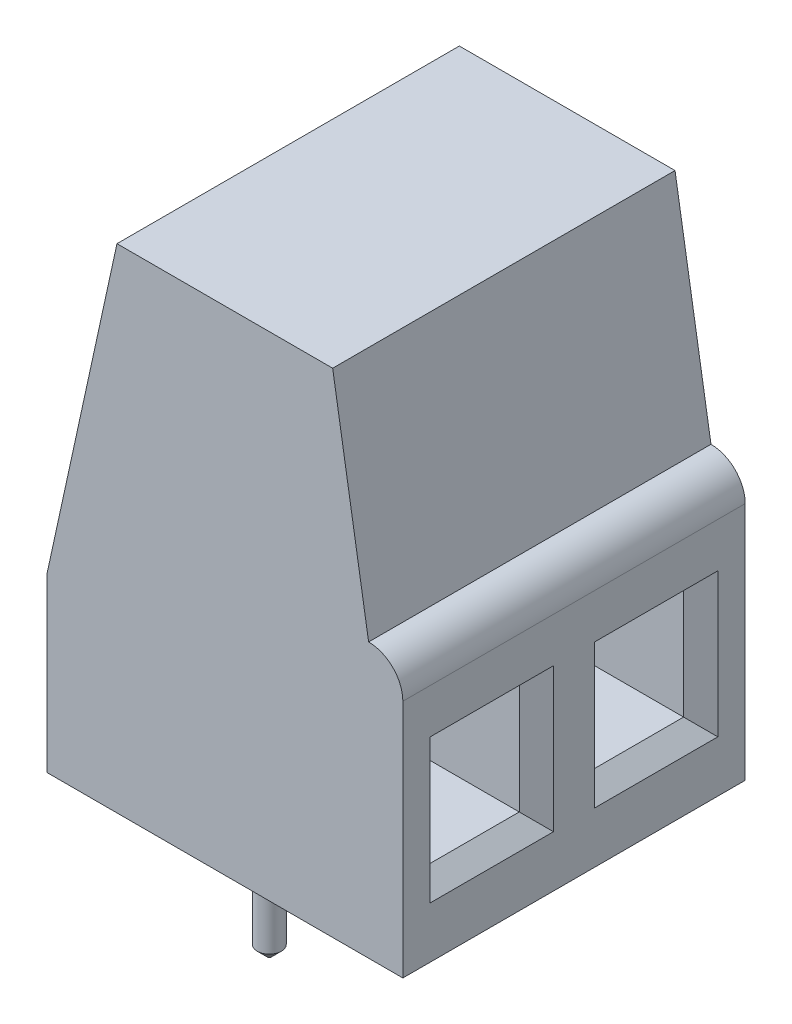
ISO-10303-21;
HEADER;
FILE_DESCRIPTION(('STEP AP214'),'2;1');
FILE_NAME('part.step','',(''),(''),'','','');
FILE_SCHEMA(('AUTOMOTIVE_DESIGN { 1 0 10303 214 1 1 1 1 }'));
ENDSEC;
DATA;
#1=APPLICATION_CONTEXT('core data for automotive mechanical design processes');
#2=APPLICATION_PROTOCOL_DEFINITION('international standard','automotive_design',2000,#1);
#3=PRODUCT_CONTEXT('',#1,'mechanical');
#4=PRODUCT('Part','Part','',(#3));
#5=PRODUCT_RELATED_PRODUCT_CATEGORY('part','',(#4));
#6=PRODUCT_DEFINITION_FORMATION('','',#4);
#7=PRODUCT_DEFINITION_CONTEXT('part definition',#1,'design');
#8=PRODUCT_DEFINITION('design','',#6,#7);
#9=PRODUCT_DEFINITION_SHAPE('','',#8);
#10=(LENGTH_UNIT() NAMED_UNIT(*) SI_UNIT(.MILLI.,.METRE.));
#11=(NAMED_UNIT(*) PLANE_ANGLE_UNIT() SI_UNIT($,.RADIAN.));
#12=(NAMED_UNIT(*) SI_UNIT($,.STERADIAN.) SOLID_ANGLE_UNIT());
#13=UNCERTAINTY_MEASURE_WITH_UNIT(LENGTH_MEASURE(1.E-05),#10,'distance_accuracy_value','');
#14=(GEOMETRIC_REPRESENTATION_CONTEXT(3) GLOBAL_UNCERTAINTY_ASSIGNED_CONTEXT((#13)) GLOBAL_UNIT_ASSIGNED_CONTEXT((#10,
#11,#12)) REPRESENTATION_CONTEXT('',''));
#15=CARTESIAN_POINT('',(0.,0.,0.));
#16=DIRECTION('',(0.,0.,1.));
#17=DIRECTION('',(1.,0.,0.));
#18=AXIS2_PLACEMENT_3D('',#15,#16,#17);
#19=CARTESIAN_POINT('',(0.,0.,-10.));
#20=DIRECTION('',(-1.,0.,0.));
#21=DIRECTION('',(0.,0.,1.));
#22=AXIS2_PLACEMENT_3D('',#19,#20,#21);
#23=PLANE('',#22);
#24=DIRECTION('',(0.,-1.,0.));
#25=VECTOR('',#24,1.);
#26=CARTESIAN_POINT('',(0.,0.,0.));
#27=LINE('',#26,#25);
#28=CARTESIAN_POINT('',(0.,5.,0.));
#29=VERTEX_POINT('',#28);
#30=CARTESIAN_POINT('',(0.,0.,0.));
#31=VERTEX_POINT('',#30);
#32=EDGE_CURVE('E219',#29,#31,#27,.T.);
#33=ORIENTED_EDGE('',*,*,#32,.F.);
#34=DIRECTION('',(0.,0.,1.));
#35=VECTOR('',#34,1.);
#36=CARTESIAN_POINT('',(0.,5.,-10.));
#37=LINE('',#36,#35);
#38=CARTESIAN_POINT('',(0.,5.,-10.));
#39=VERTEX_POINT('',#38);
#40=EDGE_CURVE('E269',#39,#29,#37,.T.);
#41=ORIENTED_EDGE('',*,*,#40,.F.);
#42=DIRECTION('',(0.,-1.,0.));
#43=VECTOR('',#42,1.);
#44=CARTESIAN_POINT('',(0.,0.,-10.));
#45=LINE('',#44,#43);
#46=CARTESIAN_POINT('',(0.,0.,-10.));
#47=VERTEX_POINT('',#46);
#48=EDGE_CURVE('E228',#39,#47,#45,.T.);
#49=ORIENTED_EDGE('',*,*,#48,.T.);
#50=DIRECTION('',(0.,0.,1.));
#51=VECTOR('',#50,1.);
#52=CARTESIAN_POINT('',(0.,0.,-10.));
#53=LINE('',#52,#51);
#54=EDGE_CURVE('E249',#47,#31,#53,.T.);
#55=ORIENTED_EDGE('',*,*,#54,.T.);
#56=EDGE_LOOP('',(#33,#41,#49,#55));
#57=FACE_BOUND('',#56,.T.);
#58=ADVANCED_FACE('F35',(#57),#23,.T.);
#59=CARTESIAN_POINT('',(2.05,14.4,-10.));
#60=DIRECTION('',(-0.977035436629317,0.213076877137245,0.));
#61=DIRECTION('',(-0.213076877137245,-0.977035436629317,0.));
#62=AXIS2_PLACEMENT_3D('',#59,#60,#61);
#63=PLANE('',#62);
#64=DIRECTION('',(-0.213076877137245,-0.977035436629317,0.));
#65=VECTOR('',#64,1.);
#66=CARTESIAN_POINT('',(2.05,14.4,0.));
#67=LINE('',#66,#65);
#68=CARTESIAN_POINT('',(2.05,14.4,0.));
#69=VERTEX_POINT('',#68);
#70=EDGE_CURVE('E232',#69,#29,#67,.T.);
#71=ORIENTED_EDGE('',*,*,#70,.F.);
#72=DIRECTION('',(0.,0.,1.));
#73=VECTOR('',#72,1.);
#74=CARTESIAN_POINT('',(2.05,14.4,-10.));
#75=LINE('',#74,#73);
#76=CARTESIAN_POINT('',(2.05,14.4,-10.));
#77=VERTEX_POINT('',#76);
#78=EDGE_CURVE('E272',#77,#69,#75,.T.);
#79=ORIENTED_EDGE('',*,*,#78,.F.);
#80=DIRECTION('',(-0.213076877137245,-0.977035436629317,0.));
#81=VECTOR('',#80,1.);
#82=CARTESIAN_POINT('',(2.05,14.4,-10.));
#83=LINE('',#82,#81);
#84=EDGE_CURVE('E246',#77,#39,#83,.T.);
#85=ORIENTED_EDGE('',*,*,#84,.T.);
#86=ORIENTED_EDGE('',*,*,#40,.T.);
#87=EDGE_LOOP('',(#71,#79,#85,#86));
#88=FACE_BOUND('',#87,.T.);
#89=ADVANCED_FACE('F353',(#88),#63,.T.);
#90=CARTESIAN_POINT('',(5.2,14.4,-10.));
#91=DIRECTION('',(0.,1.,0.));
#92=DIRECTION('',(0.,0.,1.));
#93=AXIS2_PLACEMENT_3D('',#90,#91,#92);
#94=PLANE('',#93);
#95=DIRECTION('',(-1.,0.,0.));
#96=VECTOR('',#95,1.);
#97=CARTESIAN_POINT('',(5.2,14.4,0.));
#98=LINE('',#97,#96);
#99=CARTESIAN_POINT('',(8.35,14.4,0.));
#100=VERTEX_POINT('',#99);
#101=EDGE_CURVE('E264',#100,#69,#98,.T.);
#102=ORIENTED_EDGE('',*,*,#101,.F.);
#103=DIRECTION('',(0.,0.,1.));
#104=VECTOR('',#103,1.);
#105=CARTESIAN_POINT('',(8.35,14.4,-10.));
#106=LINE('',#105,#104);
#107=CARTESIAN_POINT('',(8.35,14.4,-10.));
#108=VERTEX_POINT('',#107);
#109=EDGE_CURVE('E274',#108,#100,#106,.T.);
#110=ORIENTED_EDGE('',*,*,#109,.F.);
#111=DIRECTION('',(-1.,0.,0.));
#112=VECTOR('',#111,1.);
#113=CARTESIAN_POINT('',(5.2,14.4,-10.));
#114=LINE('',#113,#112);
#115=EDGE_CURVE('E244',#108,#77,#114,.T.);
#116=ORIENTED_EDGE('',*,*,#115,.T.);
#117=ORIENTED_EDGE('',*,*,#78,.T.);
#118=EDGE_LOOP('',(#102,#110,#116,#117));
#119=FACE_BOUND('',#118,.T.);
#120=ADVANCED_FACE('F359',(#119),#94,.T.);
#121=CARTESIAN_POINT('',(8.35,14.4,-10.));
#122=DIRECTION('',(0.986807480949376,0.161898102343257,0.));
#123=DIRECTION('',(-0.161898102343257,0.986807480949376,0.));
#124=AXIS2_PLACEMENT_3D('',#121,#122,#123);
#125=PLANE('',#124);
#126=DIRECTION('',(-0.161898102343257,0.986807480949376,0.));
#127=VECTOR('',#126,1.);
#128=CARTESIAN_POINT('',(8.35,14.4,0.));
#129=LINE('',#128,#127);
#130=CARTESIAN_POINT('',(9.4,8.,0.));
#131=VERTEX_POINT('',#130);
#132=EDGE_CURVE('E261',#131,#100,#129,.T.);
#133=ORIENTED_EDGE('',*,*,#132,.F.);
#134=DIRECTION('',(0.,0.,1.));
#135=VECTOR('',#134,1.);
#136=CARTESIAN_POINT('',(9.4,8.,-10.));
#137=LINE('',#136,#135);
#138=CARTESIAN_POINT('',(9.4,8.,-10.));
#139=VERTEX_POINT('',#138);
#140=EDGE_CURVE('E277',#139,#131,#137,.T.);
#141=ORIENTED_EDGE('',*,*,#140,.F.);
#142=DIRECTION('',(-0.161898102343257,0.986807480949376,0.));
#143=VECTOR('',#142,1.);
#144=CARTESIAN_POINT('',(8.35,14.4,-10.));
#145=LINE('',#144,#143);
#146=EDGE_CURVE('E241',#139,#108,#145,.T.);
#147=ORIENTED_EDGE('',*,*,#146,.T.);
#148=ORIENTED_EDGE('',*,*,#109,.T.);
#149=EDGE_LOOP('',(#133,#141,#147,#148));
#150=FACE_BOUND('',#149,.T.);
#151=ADVANCED_FACE('F459',(#150),#125,.T.);
#152=CARTESIAN_POINT('',(9.4,7.,-10.));
#153=DIRECTION('',(0.,0.,1.));
#154=DIRECTION('',(1.,0.,0.));
#155=AXIS2_PLACEMENT_3D('',#152,#153,#154);
#156=CYLINDRICAL_SURFACE('',#155,1.);
#157=CARTESIAN_POINT('',(9.4,7.,0.));
#158=DIRECTION('',(0.,0.,1.));
#159=DIRECTION('',(1.,0.,0.));
#160=AXIS2_PLACEMENT_3D('',#157,#158,#159);
#161=CIRCLE('',#160,1.);
#162=CARTESIAN_POINT('',(10.4,7.,0.));
#163=VERTEX_POINT('',#162);
#164=EDGE_CURVE('E258',#163,#131,#161,.T.);
#165=ORIENTED_EDGE('',*,*,#164,.F.);
#166=DIRECTION('',(0.,0.,1.));
#167=VECTOR('',#166,1.);
#168=CARTESIAN_POINT('',(10.4,7.,-10.));
#169=LINE('',#168,#167);
#170=CARTESIAN_POINT('',(10.4,7.,-10.));
#171=VERTEX_POINT('',#170);
#172=EDGE_CURVE('E279',#171,#163,#169,.T.);
#173=ORIENTED_EDGE('',*,*,#172,.F.);
#174=CARTESIAN_POINT('',(9.4,7.,-10.));
#175=DIRECTION('',(0.,0.,1.));
#176=DIRECTION('',(1.,0.,0.));
#177=AXIS2_PLACEMENT_3D('',#174,#175,#176);
#178=CIRCLE('',#177,1.);
#179=EDGE_CURVE('E238',#171,#139,#178,.T.);
#180=ORIENTED_EDGE('',*,*,#179,.T.);
#181=ORIENTED_EDGE('',*,*,#140,.T.);
#182=EDGE_LOOP('',(#165,#173,#180,#181));
#183=FACE_BOUND('',#182,.T.);
#184=ADVANCED_FACE('F463',(#183),#156,.T.);
#185=CARTESIAN_POINT('',(10.4,0.,-10.));
#186=DIRECTION('',(1.,0.,0.));
#187=DIRECTION('',(0.,0.,-1.));
#188=AXIS2_PLACEMENT_3D('',#185,#186,#187);
#189=PLANE('',#188);
#190=DIRECTION('',(0.,0.,1.));
#191=VECTOR('',#190,1.);
#192=CARTESIAN_POINT('',(10.4,1.5,-6.1));
#193=LINE('',#192,#191);
#194=CARTESIAN_POINT('',(10.4,1.5,-9.2));
#195=VERTEX_POINT('',#194);
#196=CARTESIAN_POINT('',(10.4,1.5,-5.6));
#197=VERTEX_POINT('',#196);
#198=EDGE_CURVE('E315',#195,#197,#193,.T.);
#199=ORIENTED_EDGE('',*,*,#198,.T.);
#200=DIRECTION('',(0.,1.,0.));
#201=VECTOR('',#200,1.);
#202=CARTESIAN_POINT('',(10.4,5.2,-5.6));
#203=LINE('',#202,#201);
#204=CARTESIAN_POINT('',(10.4,5.7,-5.6));
#205=VERTEX_POINT('',#204);
#206=EDGE_CURVE('E317',#197,#205,#203,.T.);
#207=ORIENTED_EDGE('',*,*,#206,.T.);
#208=DIRECTION('',(0.,0.,-1.));
#209=VECTOR('',#208,1.);
#210=CARTESIAN_POINT('',(10.4,5.7,-8.7));
#211=LINE('',#210,#209);
#212=CARTESIAN_POINT('',(10.4,5.7,-9.2));
#213=VERTEX_POINT('',#212);
#214=EDGE_CURVE('E311',#205,#213,#211,.T.);
#215=ORIENTED_EDGE('',*,*,#214,.T.);
#216=DIRECTION('',(0.,-1.,0.));
#217=VECTOR('',#216,1.);
#218=CARTESIAN_POINT('',(10.4,2.,-9.2));
#219=LINE('',#218,#217);
#220=EDGE_CURVE('E313',#213,#195,#219,.T.);
#221=ORIENTED_EDGE('',*,*,#220,.T.);
#222=EDGE_LOOP('',(#199,#207,#215,#221));
#223=FACE_BOUND('',#222,.T.);
#224=DIRECTION('',(0.,-1.,0.));
#225=VECTOR('',#224,1.);
#226=CARTESIAN_POINT('',(10.4,2.,-4.4));
#227=LINE('',#226,#225);
#228=CARTESIAN_POINT('',(10.4,5.7,-4.4));
#229=VERTEX_POINT('',#228);
#230=CARTESIAN_POINT('',(10.4,1.5,-4.4));
#231=VERTEX_POINT('',#230);
#232=EDGE_CURVE('E290',#229,#231,#227,.T.);
#233=ORIENTED_EDGE('',*,*,#232,.T.);
#234=DIRECTION('',(0.,0.,1.));
#235=VECTOR('',#234,1.);
#236=CARTESIAN_POINT('',(10.4,1.5,-1.3));
#237=LINE('',#236,#235);
#238=CARTESIAN_POINT('',(10.4,1.5,-0.799999999999997));
#239=VERTEX_POINT('',#238);
#240=EDGE_CURVE('E292',#231,#239,#237,.T.);
#241=ORIENTED_EDGE('',*,*,#240,.T.);
#242=DIRECTION('',(0.,1.,0.));
#243=VECTOR('',#242,1.);
#244=CARTESIAN_POINT('',(10.4,5.2,-0.799999999999997));
#245=LINE('',#244,#243);
#246=CARTESIAN_POINT('',(10.4,5.7,-0.799999999999997));
#247=VERTEX_POINT('',#246);
#248=EDGE_CURVE('E286',#239,#247,#245,.T.);
#249=ORIENTED_EDGE('',*,*,#248,.T.);
#250=DIRECTION('',(0.,0.,-1.));
#251=VECTOR('',#250,1.);
#252=CARTESIAN_POINT('',(10.4,5.7,-3.9));
#253=LINE('',#252,#251);
#254=EDGE_CURVE('E288',#247,#229,#253,.T.);
#255=ORIENTED_EDGE('',*,*,#254,.T.);
#256=EDGE_LOOP('',(#233,#241,#249,#255));
#257=FACE_BOUND('',#256,.T.);
#258=DIRECTION('',(0.,1.,0.));
#259=VECTOR('',#258,1.);
#260=CARTESIAN_POINT('',(10.4,0.,0.));
#261=LINE('',#260,#259);
#262=CARTESIAN_POINT('',(10.4,0.,0.));
#263=VERTEX_POINT('',#262);
#264=EDGE_CURVE('E255',#263,#163,#261,.T.);
#265=ORIENTED_EDGE('',*,*,#264,.F.);
#266=DIRECTION('',(0.,0.,1.));
#267=VECTOR('',#266,1.);
#268=CARTESIAN_POINT('',(10.4,0.,-10.));
#269=LINE('',#268,#267);
#270=CARTESIAN_POINT('',(10.4,0.,-10.));
#271=VERTEX_POINT('',#270);
#272=EDGE_CURVE('E281',#271,#263,#269,.T.);
#273=ORIENTED_EDGE('',*,*,#272,.F.);
#274=DIRECTION('',(0.,1.,0.));
#275=VECTOR('',#274,1.);
#276=CARTESIAN_POINT('',(10.4,0.,-10.));
#277=LINE('',#276,#275);
#278=EDGE_CURVE('E235',#271,#171,#277,.T.);
#279=ORIENTED_EDGE('',*,*,#278,.T.);
#280=ORIENTED_EDGE('',*,*,#172,.T.);
#281=EDGE_LOOP('',(#265,#273,#279,#280));
#282=FACE_BOUND('',#281,.T.);
#283=ADVANCED_FACE('F407',(#223,#257,#282),#189,.T.);
#284=CARTESIAN_POINT('',(0.,0.,-10.));
#285=DIRECTION('',(0.,-1.,0.));
#286=DIRECTION('',(0.,0.,-1.));
#287=AXIS2_PLACEMENT_3D('',#284,#285,#286);
#288=PLANE('',#287);
#289=CARTESIAN_POINT('',(4.3,0.,-7.8));
#290=DIRECTION('',(0.,-1.,0.));
#291=DIRECTION('',(0.,0.,-1.));
#292=AXIS2_PLACEMENT_3D('',#289,#290,#291);
#293=CIRCLE('',#292,0.35);
#294=CARTESIAN_POINT('',(4.3,0.,-8.15));
#295=VERTEX_POINT('',#294);
#296=EDGE_CURVE('E477',#295,#295,#293,.T.);
#297=ORIENTED_EDGE('',*,*,#296,.F.);
#298=EDGE_LOOP('',(#297));
#299=FACE_BOUND('',#298,.T.);
#300=CARTESIAN_POINT('',(4.3,0.,-2.2));
#301=DIRECTION('',(0.,-1.,0.));
#302=DIRECTION('',(0.,0.,-1.));
#303=AXIS2_PLACEMENT_3D('',#300,#301,#302);
#304=CIRCLE('',#303,0.35);
#305=CARTESIAN_POINT('',(4.3,0.,-2.55));
#306=VERTEX_POINT('',#305);
#307=EDGE_CURVE('E193',#306,#306,#304,.T.);
#308=ORIENTED_EDGE('',*,*,#307,.F.);
#309=EDGE_LOOP('',(#308));
#310=FACE_BOUND('',#309,.T.);
#311=DIRECTION('',(1.,0.,0.));
#312=VECTOR('',#311,1.);
#313=CARTESIAN_POINT('',(0.,0.,0.));
#314=LINE('',#313,#312);
#315=EDGE_CURVE('E252',#31,#263,#314,.T.);
#316=ORIENTED_EDGE('',*,*,#315,.F.);
#317=ORIENTED_EDGE('',*,*,#54,.F.);
#318=DIRECTION('',(1.,0.,0.));
#319=VECTOR('',#318,1.);
#320=CARTESIAN_POINT('',(0.,0.,-10.));
#321=LINE('',#320,#319);
#322=EDGE_CURVE('E231',#47,#271,#321,.T.);
#323=ORIENTED_EDGE('',*,*,#322,.T.);
#324=ORIENTED_EDGE('',*,*,#272,.T.);
#325=EDGE_LOOP('',(#316,#317,#323,#324));
#326=FACE_BOUND('',#325,.T.);
#327=ADVANCED_FACE('F365',(#299,#310,#326),#288,.T.);
#328=CARTESIAN_POINT('',(9.4,7.,-10.));
#329=DIRECTION('',(0.,0.,1.));
#330=DIRECTION('',(1.,0.,0.));
#331=AXIS2_PLACEMENT_3D('',#328,#329,#330);
#332=PLANE('',#331);
#333=ORIENTED_EDGE('',*,*,#48,.F.);
#334=ORIENTED_EDGE('',*,*,#84,.F.);
#335=ORIENTED_EDGE('',*,*,#115,.F.);
#336=ORIENTED_EDGE('',*,*,#146,.F.);
#337=ORIENTED_EDGE('',*,*,#179,.F.);
#338=ORIENTED_EDGE('',*,*,#278,.F.);
#339=ORIENTED_EDGE('',*,*,#322,.F.);
#340=EDGE_LOOP('',(#333,#334,#335,#336,#337,#338,#339));
#341=FACE_BOUND('',#340,.T.);
#342=ADVANCED_FACE('F450',(#341),#332,.F.);
#343=CARTESIAN_POINT('',(9.4,7.,0.));
#344=DIRECTION('',(0.,0.,1.));
#345=DIRECTION('',(1.,0.,0.));
#346=AXIS2_PLACEMENT_3D('',#343,#344,#345);
#347=PLANE('',#346);
#348=ORIENTED_EDGE('',*,*,#32,.T.);
#349=ORIENTED_EDGE('',*,*,#315,.T.);
#350=ORIENTED_EDGE('',*,*,#264,.T.);
#351=ORIENTED_EDGE('',*,*,#164,.T.);
#352=ORIENTED_EDGE('',*,*,#132,.T.);
#353=ORIENTED_EDGE('',*,*,#101,.T.);
#354=ORIENTED_EDGE('',*,*,#70,.T.);
#355=EDGE_LOOP('',(#348,#349,#350,#351,#352,#353,#354));
#356=FACE_BOUND('',#355,.T.);
#357=ADVANCED_FACE('F448',(#356),#347,.T.);
#358=CARTESIAN_POINT('',(5.4,2.,-1.3));
#359=DIRECTION('',(0.,0.,1.));
#360=DIRECTION('',(1.,0.,0.));
#361=AXIS2_PLACEMENT_3D('',#358,#359,#360);
#362=PLANE('',#361);
#363=DIRECTION('',(1.,0.,0.));
#364=VECTOR('',#363,1.);
#365=CARTESIAN_POINT('',(5.4,5.2,-1.3));
#366=LINE('',#365,#364);
#367=CARTESIAN_POINT('',(5.4,5.2,-1.3));
#368=VERTEX_POINT('',#367);
#369=CARTESIAN_POINT('',(9.9,5.2,-1.3));
#370=VERTEX_POINT('',#369);
#371=EDGE_CURVE('E216',#368,#370,#366,.T.);
#372=ORIENTED_EDGE('',*,*,#371,.T.);
#373=DIRECTION('',(0.,-1.,0.));
#374=VECTOR('',#373,1.);
#375=CARTESIAN_POINT('',(9.9,2.,-1.3));
#376=LINE('',#375,#374);
#377=CARTESIAN_POINT('',(9.9,2.,-1.3));
#378=VERTEX_POINT('',#377);
#379=EDGE_CURVE('E299',#370,#378,#376,.T.);
#380=ORIENTED_EDGE('',*,*,#379,.T.);
#381=DIRECTION('',(1.,0.,0.));
#382=VECTOR('',#381,1.);
#383=CARTESIAN_POINT('',(5.4,2.,-1.3));
#384=LINE('',#383,#382);
#385=CARTESIAN_POINT('',(5.4,2.,-1.3));
#386=VERTEX_POINT('',#385);
#387=EDGE_CURVE('E215',#386,#378,#384,.T.);
#388=ORIENTED_EDGE('',*,*,#387,.F.);
#389=DIRECTION('',(0.,-1.,0.));
#390=VECTOR('',#389,1.);
#391=CARTESIAN_POINT('',(5.4,2.,-1.3));
#392=LINE('',#391,#390);
#393=EDGE_CURVE('E200',#368,#386,#392,.T.);
#394=ORIENTED_EDGE('',*,*,#393,.F.);
#395=EDGE_LOOP('',(#372,#380,#388,#394));
#396=FACE_BOUND('',#395,.T.);
#397=ADVANCED_FACE('F438',(#396),#362,.F.);
#398=CARTESIAN_POINT('',(5.4,5.2,-1.3));
#399=DIRECTION('',(0.,1.,0.));
#400=DIRECTION('',(0.,0.,1.));
#401=AXIS2_PLACEMENT_3D('',#398,#399,#400);
#402=PLANE('',#401);
#403=DIRECTION('',(1.,0.,0.));
#404=VECTOR('',#403,1.);
#405=CARTESIAN_POINT('',(5.4,5.2,-3.9));
#406=LINE('',#405,#404);
#407=CARTESIAN_POINT('',(5.4,5.2,-3.9));
#408=VERTEX_POINT('',#407);
#409=CARTESIAN_POINT('',(9.9,5.2,-3.9));
#410=VERTEX_POINT('',#409);
#411=EDGE_CURVE('E220',#408,#410,#406,.T.);
#412=ORIENTED_EDGE('',*,*,#411,.T.);
#413=DIRECTION('',(0.,0.,1.));
#414=VECTOR('',#413,1.);
#415=CARTESIAN_POINT('',(9.9,5.2,-1.3));
#416=LINE('',#415,#414);
#417=EDGE_CURVE('E297',#410,#370,#416,.T.);
#418=ORIENTED_EDGE('',*,*,#417,.T.);
#419=ORIENTED_EDGE('',*,*,#371,.F.);
#420=DIRECTION('',(0.,0.,1.));
#421=VECTOR('',#420,1.);
#422=CARTESIAN_POINT('',(5.4,5.2,-1.3));
#423=LINE('',#422,#421);
#424=EDGE_CURVE('E212',#408,#368,#423,.T.);
#425=ORIENTED_EDGE('',*,*,#424,.F.);
#426=EDGE_LOOP('',(#412,#418,#419,#425));
#427=FACE_BOUND('',#426,.T.);
#428=ADVANCED_FACE('F434',(#427),#402,.F.);
#429=CARTESIAN_POINT('',(5.4,2.,-3.9));
#430=DIRECTION('',(0.,0.,-1.));
#431=DIRECTION('',(-1.,0.,0.));
#432=AXIS2_PLACEMENT_3D('',#429,#430,#431);
#433=PLANE('',#432);
#434=DIRECTION('',(1.,0.,0.));
#435=VECTOR('',#434,1.);
#436=CARTESIAN_POINT('',(5.4,2.,-3.9));
#437=LINE('',#436,#435);
#438=CARTESIAN_POINT('',(5.4,2.,-3.9));
#439=VERTEX_POINT('',#438);
#440=CARTESIAN_POINT('',(9.9,2.,-3.9));
#441=VERTEX_POINT('',#440);
#442=EDGE_CURVE('E223',#439,#441,#437,.T.);
#443=ORIENTED_EDGE('',*,*,#442,.T.);
#444=DIRECTION('',(0.,1.,0.));
#445=VECTOR('',#444,1.);
#446=CARTESIAN_POINT('',(9.9,5.2,-3.9));
#447=LINE('',#446,#445);
#448=EDGE_CURVE('E295',#441,#410,#447,.T.);
#449=ORIENTED_EDGE('',*,*,#448,.T.);
#450=ORIENTED_EDGE('',*,*,#411,.F.);
#451=DIRECTION('',(0.,1.,0.));
#452=VECTOR('',#451,1.);
#453=CARTESIAN_POINT('',(5.4,2.,-3.9));
#454=LINE('',#453,#452);
#455=EDGE_CURVE('E209',#439,#408,#454,.T.);
#456=ORIENTED_EDGE('',*,*,#455,.F.);
#457=EDGE_LOOP('',(#443,#449,#450,#456));
#458=FACE_BOUND('',#457,.T.);
#459=ADVANCED_FACE('F437',(#458),#433,.F.);
#460=CARTESIAN_POINT('',(5.4,2.,-1.3));
#461=DIRECTION('',(0.,-1.,0.));
#462=DIRECTION('',(0.,0.,-1.));
#463=AXIS2_PLACEMENT_3D('',#460,#461,#462);
#464=PLANE('',#463);
#465=ORIENTED_EDGE('',*,*,#387,.T.);
#466=DIRECTION('',(0.,0.,-1.));
#467=VECTOR('',#466,1.);
#468=CARTESIAN_POINT('',(9.9,2.,-3.9));
#469=LINE('',#468,#467);
#470=EDGE_CURVE('E271',#378,#441,#469,.T.);
#471=ORIENTED_EDGE('',*,*,#470,.T.);
#472=ORIENTED_EDGE('',*,*,#442,.F.);
#473=DIRECTION('',(0.,0.,-1.));
#474=VECTOR('',#473,1.);
#475=CARTESIAN_POINT('',(5.4,2.,-1.3));
#476=LINE('',#475,#474);
#477=EDGE_CURVE('E206',#386,#439,#476,.T.);
#478=ORIENTED_EDGE('',*,*,#477,.F.);
#479=EDGE_LOOP('',(#465,#471,#472,#478));
#480=FACE_BOUND('',#479,.T.);
#481=ADVANCED_FACE('F432',(#480),#464,.F.);
#482=CARTESIAN_POINT('',(5.4,0.,0.));
#483=DIRECTION('',(-1.,0.,0.));
#484=DIRECTION('',(0.,0.,1.));
#485=AXIS2_PLACEMENT_3D('',#482,#483,#484);
#486=PLANE('',#485);
#487=ORIENTED_EDGE('',*,*,#393,.T.);
#488=ORIENTED_EDGE('',*,*,#477,.T.);
#489=ORIENTED_EDGE('',*,*,#455,.T.);
#490=ORIENTED_EDGE('',*,*,#424,.T.);
#491=EDGE_LOOP('',(#487,#488,#489,#490));
#492=FACE_BOUND('',#491,.T.);
#493=ADVANCED_FACE('F423',(#492),#486,.F.);
#494=CARTESIAN_POINT('',(5.4,2.,-8.7));
#495=DIRECTION('',(0.,0.,-1.));
#496=DIRECTION('',(-1.,0.,0.));
#497=AXIS2_PLACEMENT_3D('',#494,#495,#496);
#498=PLANE('',#497);
#499=DIRECTION('',(1.,0.,0.));
#500=VECTOR('',#499,1.);
#501=CARTESIAN_POINT('',(5.4,2.,-8.7));
#502=LINE('',#501,#500);
#503=CARTESIAN_POINT('',(5.4,2.,-8.7));
#504=VERTEX_POINT('',#503);
#505=CARTESIAN_POINT('',(9.9,2.,-8.7));
#506=VERTEX_POINT('',#505);
#507=EDGE_CURVE('E198',#504,#506,#502,.T.);
#508=ORIENTED_EDGE('',*,*,#507,.T.);
#509=DIRECTION('',(0.,1.,0.));
#510=VECTOR('',#509,1.);
#511=CARTESIAN_POINT('',(9.9,5.2,-8.7));
#512=LINE('',#511,#510);
#513=CARTESIAN_POINT('',(9.9,5.2,-8.7));
#514=VERTEX_POINT('',#513);
#515=EDGE_CURVE('E50',#506,#514,#512,.T.);
#516=ORIENTED_EDGE('',*,*,#515,.T.);
#517=DIRECTION('',(1.,0.,0.));
#518=VECTOR('',#517,1.);
#519=CARTESIAN_POINT('',(5.4,5.2,-8.7));
#520=LINE('',#519,#518);
#521=CARTESIAN_POINT('',(5.4,5.2,-8.7));
#522=VERTEX_POINT('',#521);
#523=EDGE_CURVE('E165',#522,#514,#520,.T.);
#524=ORIENTED_EDGE('',*,*,#523,.F.);
#525=DIRECTION('',(0.,1.,0.));
#526=VECTOR('',#525,1.);
#527=CARTESIAN_POINT('',(5.4,2.,-8.7));
#528=LINE('',#527,#526);
#529=EDGE_CURVE('E169',#504,#522,#528,.T.);
#530=ORIENTED_EDGE('',*,*,#529,.F.);
#531=EDGE_LOOP('',(#508,#516,#524,#530));
#532=FACE_BOUND('',#531,.T.);
#533=ADVANCED_FACE('F167',(#532),#498,.F.);
#534=CARTESIAN_POINT('',(5.4,2.,-8.7));
#535=DIRECTION('',(0.,-1.,0.));
#536=DIRECTION('',(0.,0.,-1.));
#537=AXIS2_PLACEMENT_3D('',#534,#535,#536);
#538=PLANE('',#537);
#539=DIRECTION('',(1.,0.,0.));
#540=VECTOR('',#539,1.);
#541=CARTESIAN_POINT('',(5.4,2.,-6.1));
#542=LINE('',#541,#540);
#543=CARTESIAN_POINT('',(5.4,2.,-6.1));
#544=VERTEX_POINT('',#543);
#545=CARTESIAN_POINT('',(9.9,2.,-6.1));
#546=VERTEX_POINT('',#545);
#547=EDGE_CURVE('E201',#544,#546,#542,.T.);
#548=ORIENTED_EDGE('',*,*,#547,.T.);
#549=DIRECTION('',(0.,0.,-1.));
#550=VECTOR('',#549,1.);
#551=CARTESIAN_POINT('',(9.9,2.,-8.7));
#552=LINE('',#551,#550);
#553=EDGE_CURVE('E58',#546,#506,#552,.T.);
#554=ORIENTED_EDGE('',*,*,#553,.T.);
#555=ORIENTED_EDGE('',*,*,#507,.F.);
#556=DIRECTION('',(0.,0.,-1.));
#557=VECTOR('',#556,1.);
#558=CARTESIAN_POINT('',(5.4,2.,-8.7));
#559=LINE('',#558,#557);
#560=EDGE_CURVE('E174',#544,#504,#559,.T.);
#561=ORIENTED_EDGE('',*,*,#560,.F.);
#562=EDGE_LOOP('',(#548,#554,#555,#561));
#563=FACE_BOUND('',#562,.T.);
#564=ADVANCED_FACE('F415',(#563),#538,.F.);
#565=CARTESIAN_POINT('',(5.4,2.,-6.1));
#566=DIRECTION('',(0.,0.,1.));
#567=DIRECTION('',(1.,0.,0.));
#568=AXIS2_PLACEMENT_3D('',#565,#566,#567);
#569=PLANE('',#568);
#570=DIRECTION('',(1.,0.,0.));
#571=VECTOR('',#570,1.);
#572=CARTESIAN_POINT('',(5.4,5.2,-6.1));
#573=LINE('',#572,#571);
#574=CARTESIAN_POINT('',(5.4,5.2,-6.1));
#575=VERTEX_POINT('',#574);
#576=CARTESIAN_POINT('',(9.9,5.2,-6.1));
#577=VERTEX_POINT('',#576);
#578=EDGE_CURVE('E173',#575,#577,#573,.T.);
#579=ORIENTED_EDGE('',*,*,#578,.T.);
#580=DIRECTION('',(0.,-1.,0.));
#581=VECTOR('',#580,1.);
#582=CARTESIAN_POINT('',(9.9,2.,-6.1));
#583=LINE('',#582,#581);
#584=EDGE_CURVE('E301',#577,#546,#583,.T.);
#585=ORIENTED_EDGE('',*,*,#584,.T.);
#586=ORIENTED_EDGE('',*,*,#547,.F.);
#587=DIRECTION('',(0.,-1.,0.));
#588=VECTOR('',#587,1.);
#589=CARTESIAN_POINT('',(5.4,2.,-6.1));
#590=LINE('',#589,#588);
#591=EDGE_CURVE('E183',#575,#544,#590,.T.);
#592=ORIENTED_EDGE('',*,*,#591,.F.);
#593=EDGE_LOOP('',(#579,#585,#586,#592));
#594=FACE_BOUND('',#593,.T.);
#595=ADVANCED_FACE('F414',(#594),#569,.F.);
#596=CARTESIAN_POINT('',(5.4,5.2,-8.7));
#597=DIRECTION('',(0.,1.,0.));
#598=DIRECTION('',(0.,0.,1.));
#599=AXIS2_PLACEMENT_3D('',#596,#597,#598);
#600=PLANE('',#599);
#601=ORIENTED_EDGE('',*,*,#523,.T.);
#602=DIRECTION('',(0.,0.,1.));
#603=VECTOR('',#602,1.);
#604=CARTESIAN_POINT('',(9.9,5.2,-6.1));
#605=LINE('',#604,#603);
#606=EDGE_CURVE('E322',#514,#577,#605,.T.);
#607=ORIENTED_EDGE('',*,*,#606,.T.);
#608=ORIENTED_EDGE('',*,*,#578,.F.);
#609=DIRECTION('',(0.,0.,1.));
#610=VECTOR('',#609,1.);
#611=CARTESIAN_POINT('',(5.4,5.2,-8.7));
#612=LINE('',#611,#610);
#613=EDGE_CURVE('E177',#522,#575,#612,.T.);
#614=ORIENTED_EDGE('',*,*,#613,.F.);
#615=EDGE_LOOP('',(#601,#607,#608,#614));
#616=FACE_BOUND('',#615,.T.);
#617=ADVANCED_FACE('F178',(#616),#600,.F.);
#618=CARTESIAN_POINT('',(5.4,0.,0.));
#619=DIRECTION('',(1.,0.,0.));
#620=DIRECTION('',(0.,0.,-1.));
#621=AXIS2_PLACEMENT_3D('',#618,#619,#620);
#622=PLANE('',#621);
#623=ORIENTED_EDGE('',*,*,#529,.T.);
#624=ORIENTED_EDGE('',*,*,#613,.T.);
#625=ORIENTED_EDGE('',*,*,#591,.T.);
#626=ORIENTED_EDGE('',*,*,#560,.T.);
#627=EDGE_LOOP('',(#623,#624,#625,#626));
#628=FACE_BOUND('',#627,.T.);
#629=ADVANCED_FACE('F185',(#628),#622,.T.);
#630=CARTESIAN_POINT('',(9.9,5.2,-1.3));
#631=DIRECTION('',(0.707106781186549,-0.707106781186546,0.));
#632=DIRECTION('',(0.,0.,-1.));
#633=AXIS2_PLACEMENT_3D('',#630,#631,#632);
#634=PLANE('',#633);
#635=DIRECTION('',(0.577350269189624,0.577350269189626,-0.577350269189626));
#636=VECTOR('',#635,1.);
#637=CARTESIAN_POINT('',(8.83333333333333,4.13333333333333,-2.83333333333333));
#638=LINE('',#637,#636);
#639=EDGE_CURVE('E190',#229,#410,#638,.F.);
#640=ORIENTED_EDGE('',*,*,#639,.F.);
#641=ORIENTED_EDGE('',*,*,#254,.F.);
#642=DIRECTION('',(0.577350269189624,0.577350269189626,0.577350269189627));
#643=VECTOR('',#642,1.);
#644=CARTESIAN_POINT('',(9.9,5.2,-1.3));
#645=LINE('',#644,#643);
#646=EDGE_CURVE('E187',#370,#247,#645,.T.);
#647=ORIENTED_EDGE('',*,*,#646,.F.);
#648=ORIENTED_EDGE('',*,*,#417,.F.);
#649=EDGE_LOOP('',(#640,#641,#647,#648));
#650=FACE_BOUND('',#649,.T.);
#651=ADVANCED_FACE('F379',(#650),#634,.T.);
#652=CARTESIAN_POINT('',(9.9,2.,-1.3));
#653=DIRECTION('',(0.707106781186549,0.,-0.707106781186546));
#654=DIRECTION('',(0.,1.,0.));
#655=AXIS2_PLACEMENT_3D('',#652,#653,#654);
#656=PLANE('',#655);
#657=ORIENTED_EDGE('',*,*,#646,.T.);
#658=ORIENTED_EDGE('',*,*,#248,.F.);
#659=DIRECTION('',(-0.577350269189624,0.577350269189626,-0.577350269189627));
#660=VECTOR('',#659,1.);
#661=CARTESIAN_POINT('',(9.9,2.,-1.3));
#662=LINE('',#661,#660);
#663=EDGE_CURVE('E304',#378,#239,#662,.F.);
#664=ORIENTED_EDGE('',*,*,#663,.F.);
#665=ORIENTED_EDGE('',*,*,#379,.F.);
#666=EDGE_LOOP('',(#657,#658,#664,#665));
#667=FACE_BOUND('',#666,.T.);
#668=ADVANCED_FACE('F375',(#667),#656,.T.);
#669=CARTESIAN_POINT('',(9.9,2.,-3.9));
#670=DIRECTION('',(0.707106781186549,0.,0.707106781186546));
#671=DIRECTION('',(0.,-1.,0.));
#672=AXIS2_PLACEMENT_3D('',#669,#670,#671);
#673=PLANE('',#672);
#674=ORIENTED_EDGE('',*,*,#639,.T.);
#675=ORIENTED_EDGE('',*,*,#448,.F.);
#676=DIRECTION('',(0.577350269189624,-0.577350269189626,-0.577350269189626));
#677=VECTOR('',#676,1.);
#678=CARTESIAN_POINT('',(9.03333333333333,2.86666666666667,-3.03333333333333));
#679=LINE('',#678,#677);
#680=EDGE_CURVE('E302',#231,#441,#679,.F.);
#681=ORIENTED_EDGE('',*,*,#680,.F.);
#682=ORIENTED_EDGE('',*,*,#232,.F.);
#683=EDGE_LOOP('',(#674,#675,#681,#682));
#684=FACE_BOUND('',#683,.T.);
#685=ADVANCED_FACE('F371',(#684),#673,.T.);
#686=CARTESIAN_POINT('',(9.9,2.,-1.3));
#687=DIRECTION('',(0.707106781186549,0.707106781186546,0.));
#688=DIRECTION('',(0.,0.,1.));
#689=AXIS2_PLACEMENT_3D('',#686,#687,#688);
#690=PLANE('',#689);
#691=ORIENTED_EDGE('',*,*,#663,.T.);
#692=ORIENTED_EDGE('',*,*,#240,.F.);
#693=ORIENTED_EDGE('',*,*,#680,.T.);
#694=ORIENTED_EDGE('',*,*,#470,.F.);
#695=EDGE_LOOP('',(#691,#692,#693,#694));
#696=FACE_BOUND('',#695,.T.);
#697=ADVANCED_FACE('F367',(#696),#690,.T.);
#698=CARTESIAN_POINT('',(9.9,2.,-8.7));
#699=DIRECTION('',(0.707106781186549,0.,0.707106781186546));
#700=DIRECTION('',(0.,-1.,0.));
#701=AXIS2_PLACEMENT_3D('',#698,#699,#700);
#702=PLANE('',#701);
#703=DIRECTION('',(0.577350269189625,-0.577350269189626,-0.577350269189627));
#704=VECTOR('',#703,1.);
#705=CARTESIAN_POINT('',(9.9,2.,-8.7));
#706=LINE('',#705,#704);
#707=EDGE_CURVE('E329',#195,#506,#706,.F.);
#708=ORIENTED_EDGE('',*,*,#707,.F.);
#709=ORIENTED_EDGE('',*,*,#220,.F.);
#710=DIRECTION('',(0.577350269189624,0.577350269189626,-0.577350269189626));
#711=VECTOR('',#710,1.);
#712=CARTESIAN_POINT('',(8.83333333333333,4.13333333333333,-7.63333333333333));
#713=LINE('',#712,#711);
#714=EDGE_CURVE('E305',#514,#213,#713,.T.);
#715=ORIENTED_EDGE('',*,*,#714,.F.);
#716=ORIENTED_EDGE('',*,*,#515,.F.);
#717=EDGE_LOOP('',(#708,#709,#715,#716));
#718=FACE_BOUND('',#717,.T.);
#719=ADVANCED_FACE('F370',(#718),#702,.T.);
#720=CARTESIAN_POINT('',(9.9,5.2,-8.7));
#721=DIRECTION('',(0.707106781186549,-0.707106781186546,0.));
#722=DIRECTION('',(0.,0.,-1.));
#723=AXIS2_PLACEMENT_3D('',#720,#721,#722);
#724=PLANE('',#723);
#725=ORIENTED_EDGE('',*,*,#714,.T.);
#726=ORIENTED_EDGE('',*,*,#214,.F.);
#727=DIRECTION('',(-0.577350269189624,-0.577350269189626,-0.577350269189626));
#728=VECTOR('',#727,1.);
#729=CARTESIAN_POINT('',(8.83333333333333,4.13333333333333,-7.16666666666667));
#730=LINE('',#729,#728);
#731=EDGE_CURVE('E327',#577,#205,#730,.F.);
#732=ORIENTED_EDGE('',*,*,#731,.F.);
#733=ORIENTED_EDGE('',*,*,#606,.F.);
#734=EDGE_LOOP('',(#725,#726,#732,#733));
#735=FACE_BOUND('',#734,.T.);
#736=ADVANCED_FACE('F392',(#735),#724,.T.);
#737=CARTESIAN_POINT('',(9.9,2.,-8.7));
#738=DIRECTION('',(0.707106781186549,0.707106781186546,0.));
#739=DIRECTION('',(0.,0.,1.));
#740=AXIS2_PLACEMENT_3D('',#737,#738,#739);
#741=PLANE('',#740);
#742=ORIENTED_EDGE('',*,*,#707,.T.);
#743=ORIENTED_EDGE('',*,*,#553,.F.);
#744=DIRECTION('',(0.577350269189624,-0.577350269189627,0.577350269189626));
#745=VECTOR('',#744,1.);
#746=CARTESIAN_POINT('',(9.9,2.,-6.1));
#747=LINE('',#746,#745);
#748=EDGE_CURVE('E325',#197,#546,#747,.F.);
#749=ORIENTED_EDGE('',*,*,#748,.F.);
#750=ORIENTED_EDGE('',*,*,#198,.F.);
#751=EDGE_LOOP('',(#742,#743,#749,#750));
#752=FACE_BOUND('',#751,.T.);
#753=ADVANCED_FACE('F388',(#752),#741,.T.);
#754=CARTESIAN_POINT('',(9.9,2.,-6.1));
#755=DIRECTION('',(0.707106781186549,0.,-0.707106781186546));
#756=DIRECTION('',(0.,1.,0.));
#757=AXIS2_PLACEMENT_3D('',#754,#755,#756);
#758=PLANE('',#757);
#759=ORIENTED_EDGE('',*,*,#731,.T.);
#760=ORIENTED_EDGE('',*,*,#206,.F.);
#761=ORIENTED_EDGE('',*,*,#748,.T.);
#762=ORIENTED_EDGE('',*,*,#584,.F.);
#763=EDGE_LOOP('',(#759,#760,#761,#762));
#764=FACE_BOUND('',#763,.T.);
#765=ADVANCED_FACE('F384',(#764),#758,.T.);
#766=CARTESIAN_POINT('',(4.3,-3.6,-2.2));
#767=DIRECTION('',(0.,1.,0.));
#768=DIRECTION('',(0.,0.,1.));
#769=AXIS2_PLACEMENT_3D('',#766,#767,#768);
#770=CYLINDRICAL_SURFACE('',#769,0.35);
#771=CARTESIAN_POINT('',(4.3,-3.3,-2.2));
#772=DIRECTION('',(0.,-1.,0.));
#773=DIRECTION('',(0.,0.,-1.));
#774=AXIS2_PLACEMENT_3D('',#771,#772,#773);
#775=CIRCLE('',#774,0.35);
#776=CARTESIAN_POINT('',(4.3,-3.3,-1.85));
#777=VERTEX_POINT('',#776);
#778=EDGE_CURVE('E11',#777,#777,#775,.F.);
#779=ORIENTED_EDGE('',*,*,#778,.T.);
#780=EDGE_LOOP('',(#779));
#781=FACE_BOUND('',#780,.T.);
#782=ORIENTED_EDGE('',*,*,#307,.T.);
#783=EDGE_LOOP('',(#782));
#784=FACE_BOUND('',#783,.T.);
#785=ADVANCED_FACE('F387',(#781,#784),#770,.T.);
#786=CARTESIAN_POINT('',(4.3,-3.6,-2.2));
#787=DIRECTION('',(0.,-1.,0.));
#788=DIRECTION('',(0.,0.,-1.));
#789=AXIS2_PLACEMENT_3D('',#786,#787,#788);
#790=PLANE('',#789);
#791=CARTESIAN_POINT('',(4.3,-3.6,-2.2));
#792=DIRECTION('',(0.,-1.,0.));
#793=DIRECTION('',(0.,0.,-1.));
#794=AXIS2_PLACEMENT_3D('',#791,#792,#793);
#795=CIRCLE('',#794,0.0500000000000014);
#796=CARTESIAN_POINT('',(4.3,-3.6,-2.15));
#797=VERTEX_POINT('',#796);
#798=EDGE_CURVE('E43',#797,#797,#795,.T.);
#799=ORIENTED_EDGE('',*,*,#798,.T.);
#800=EDGE_LOOP('',(#799));
#801=FACE_BOUND('',#800,.T.);
#802=ADVANCED_FACE('F341',(#801),#790,.T.);
#803=CARTESIAN_POINT('',(4.3,-3.6,-7.8));
#804=DIRECTION('',(0.,1.,0.));
#805=DIRECTION('',(0.,0.,1.));
#806=AXIS2_PLACEMENT_3D('',#803,#804,#805);
#807=CYLINDRICAL_SURFACE('',#806,0.35);
#808=CARTESIAN_POINT('',(4.3,-3.3,-7.8));
#809=DIRECTION('',(0.,-1.,0.));
#810=DIRECTION('',(0.,0.,-1.));
#811=AXIS2_PLACEMENT_3D('',#808,#809,#810);
#812=CIRCLE('',#811,0.35);
#813=CARTESIAN_POINT('',(4.3,-3.3,-7.45));
#814=VERTEX_POINT('',#813);
#815=EDGE_CURVE('E336',#814,#814,#812,.F.);
#816=ORIENTED_EDGE('',*,*,#815,.T.);
#817=EDGE_LOOP('',(#816));
#818=FACE_BOUND('',#817,.T.);
#819=ORIENTED_EDGE('',*,*,#296,.T.);
#820=EDGE_LOOP('',(#819));
#821=FACE_BOUND('',#820,.T.);
#822=ADVANCED_FACE('F497',(#818,#821),#807,.T.);
#823=CARTESIAN_POINT('',(4.3,-3.6,-7.8));
#824=DIRECTION('',(0.,-1.,0.));
#825=DIRECTION('',(0.,0.,-1.));
#826=AXIS2_PLACEMENT_3D('',#823,#824,#825);
#827=PLANE('',#826);
#828=CARTESIAN_POINT('',(4.3,-3.6,-7.8));
#829=DIRECTION('',(0.,-1.,0.));
#830=DIRECTION('',(0.,0.,-1.));
#831=AXIS2_PLACEMENT_3D('',#828,#829,#830);
#832=CIRCLE('',#831,0.0499999999999945);
#833=CARTESIAN_POINT('',(4.3,-3.6,-7.75000000000001));
#834=VERTEX_POINT('',#833);
#835=EDGE_CURVE('E324',#834,#834,#832,.T.);
#836=ORIENTED_EDGE('',*,*,#835,.T.);
#837=EDGE_LOOP('',(#836));
#838=FACE_BOUND('',#837,.T.);
#839=ADVANCED_FACE('F349',(#838),#827,.T.);
#840=CARTESIAN_POINT('',(4.3,-3.6,-7.8));
#841=DIRECTION('',(0.,1.,0.));
#842=DIRECTION('',(0.,0.,1.));
#843=AXIS2_PLACEMENT_3D('',#840,#841,#842);
#844=CONICAL_SURFACE('',#843,0.0499999999999945,0.785398163397453);
#845=CARTESIAN_POINT('',(4.3,-3.3,-7.45));
#846=CARTESIAN_POINT('',(4.3,-3.303125,-7.453125));
#847=CARTESIAN_POINT('',(4.3,-3.30625,-7.45625));
#848=CARTESIAN_POINT('',(4.3,-3.3125,-7.4625));
#849=CARTESIAN_POINT('',(4.3,-3.315625,-7.465625));
#850=CARTESIAN_POINT('',(4.3,-3.321875,-7.471875));
#851=CARTESIAN_POINT('',(4.3,-3.325,-7.475));
#852=CARTESIAN_POINT('',(4.3,-3.33125,-7.48125));
#853=CARTESIAN_POINT('',(4.3,-3.334375,-7.484375));
#854=CARTESIAN_POINT('',(4.3,-3.340625,-7.490625));
#855=CARTESIAN_POINT('',(4.3,-3.34375,-7.49375));
#856=CARTESIAN_POINT('',(4.3,-3.35,-7.5));
#857=CARTESIAN_POINT('',(4.3,-3.353125,-7.503125));
#858=CARTESIAN_POINT('',(4.3,-3.359375,-7.509375));
#859=CARTESIAN_POINT('',(4.3,-3.3625,-7.5125));
#860=CARTESIAN_POINT('',(4.3,-3.36875,-7.51875));
#861=CARTESIAN_POINT('',(4.3,-3.371875,-7.521875));
#862=CARTESIAN_POINT('',(4.3,-3.378125,-7.528125));
#863=CARTESIAN_POINT('',(4.3,-3.38125,-7.53125));
#864=CARTESIAN_POINT('',(4.3,-3.3875,-7.5375));
#865=CARTESIAN_POINT('',(4.3,-3.390625,-7.540625));
#866=CARTESIAN_POINT('',(4.3,-3.396875,-7.546875));
#867=CARTESIAN_POINT('',(4.3,-3.4,-7.55));
#868=CARTESIAN_POINT('',(4.3,-3.40625,-7.55625));
#869=CARTESIAN_POINT('',(4.3,-3.409375,-7.559375));
#870=CARTESIAN_POINT('',(4.3,-3.415625,-7.565625));
#871=CARTESIAN_POINT('',(4.3,-3.41875,-7.56875));
#872=CARTESIAN_POINT('',(4.3,-3.425,-7.575));
#873=CARTESIAN_POINT('',(4.3,-3.428125,-7.578125));
#874=CARTESIAN_POINT('',(4.3,-3.434375,-7.584375));
#875=CARTESIAN_POINT('',(4.3,-3.4375,-7.5875));
#876=CARTESIAN_POINT('',(4.3,-3.44375,-7.59375));
#877=CARTESIAN_POINT('',(4.3,-3.446875,-7.596875));
#878=CARTESIAN_POINT('',(4.3,-3.453125,-7.603125));
#879=CARTESIAN_POINT('',(4.3,-3.45625,-7.60625));
#880=CARTESIAN_POINT('',(4.3,-3.4625,-7.6125));
#881=CARTESIAN_POINT('',(4.3,-3.465625,-7.615625));
#882=CARTESIAN_POINT('',(4.3,-3.471875,-7.621875));
#883=CARTESIAN_POINT('',(4.3,-3.475,-7.625));
#884=CARTESIAN_POINT('',(4.3,-3.48125,-7.63125));
#885=CARTESIAN_POINT('',(4.3,-3.484375,-7.634375));
#886=CARTESIAN_POINT('',(4.3,-3.490625,-7.640625));
#887=CARTESIAN_POINT('',(4.3,-3.49375,-7.64375));
#888=CARTESIAN_POINT('',(4.3,-3.5,-7.65));
#889=CARTESIAN_POINT('',(4.3,-3.503125,-7.653125));
#890=CARTESIAN_POINT('',(4.3,-3.509375,-7.659375));
#891=CARTESIAN_POINT('',(4.3,-3.5125,-7.6625));
#892=CARTESIAN_POINT('',(4.3,-3.51875,-7.66875));
#893=CARTESIAN_POINT('',(4.3,-3.521875,-7.671875));
#894=CARTESIAN_POINT('',(4.3,-3.528125,-7.678125));
#895=CARTESIAN_POINT('',(4.3,-3.53125,-7.68125));
#896=CARTESIAN_POINT('',(4.3,-3.5375,-7.6875));
#897=CARTESIAN_POINT('',(4.3,-3.540625,-7.690625));
#898=CARTESIAN_POINT('',(4.3,-3.546875,-7.696875));
#899=CARTESIAN_POINT('',(4.3,-3.55,-7.7));
#900=CARTESIAN_POINT('',(4.3,-3.55625,-7.70625));
#901=CARTESIAN_POINT('',(4.3,-3.559375,-7.709375));
#902=CARTESIAN_POINT('',(4.3,-3.565625,-7.715625));
#903=CARTESIAN_POINT('',(4.3,-3.56875,-7.71875));
#904=CARTESIAN_POINT('',(4.3,-3.575,-7.725));
#905=CARTESIAN_POINT('',(4.3,-3.578125,-7.728125));
#906=CARTESIAN_POINT('',(4.3,-3.584375,-7.734375));
#907=CARTESIAN_POINT('',(4.3,-3.5875,-7.73750000000001));
#908=CARTESIAN_POINT('',(4.3,-3.59375,-7.74375));
#909=CARTESIAN_POINT('',(4.3,-3.596875,-7.746875));
#910=CARTESIAN_POINT('',(4.3,-3.6,-7.75000000000001));
#911=B_SPLINE_CURVE_WITH_KNOTS('',3,(#845,#846,#847,#848,#849,#850,#851,#852,#853,#854,#855,
#856,#857,#858,#859,#860,#861,#862,#863,#864,#865,#866,#867,#868,#869,#870,#871,#872,#873,#874,
#875,#876,#877,#878,#879,#880,#881,#882,#883,#884,#885,#886,#887,#888,#889,#890,#891,#892,#893,
#894,#895,#896,#897,#898,#899,#900,#901,#902,#903,#904,#905,#906,#907,#908,#909,#910),
.UNSPECIFIED.,.F.,.F.,(4,2,2,2,2,2,2,2,2,2,2,2,2,2,2,2,2,2,2,2,2,2,2,2,2,2,2,2,2,2,2,2,4),(0.,
0.0132582521472475,0.0265165042944954,0.0397747564417435,0.0530330085889914,0.0662912607362389,
0.0795495128834873,0.0928077650307349,0.106066017177983,0.119324269325231,0.132582521472479,
0.145840773619727,0.159099025766975,0.172357277914223,0.185615530061471,0.198873782208719,
0.212132034355967,0.225390286503214,0.238648538650462,0.251906790797711,0.265165042944958,
0.278423295092206,0.291681547239454,0.304939799386702,0.31819805153395,0.331456303681198,
0.344714555828446,0.357972807975694,0.371231060122942,0.38448931227019,0.397747564417438,
0.411005816564685,0.424264068711934),.UNSPECIFIED.);
#912=EDGE_CURVE('BSEAM344',#814,#834,#911,.T.);
#913=ORIENTED_EDGE('',*,*,#815,.F.);
#914=ORIENTED_EDGE('',*,*,#835,.F.);
#915=ORIENTED_EDGE('',*,*,#912,.T.);
#916=ORIENTED_EDGE('',*,*,#912,.F.);
#917=EDGE_LOOP('',(#913,#915,#914,#916));
#918=FACE_BOUND('',#917,.T.);
#919=ADVANCED_FACE('F344',(#918),#844,.T.);
#920=CARTESIAN_POINT('',(4.3,-3.6,-2.2));
#921=DIRECTION('',(0.,1.,0.));
#922=DIRECTION('',(0.,0.,1.));
#923=AXIS2_PLACEMENT_3D('',#920,#921,#922);
#924=CONICAL_SURFACE('',#923,0.0500000000000014,0.785398163397446);
#925=CARTESIAN_POINT('',(4.3,-3.3,-1.85));
#926=CARTESIAN_POINT('',(4.3,-3.303125,-1.853125));
#927=CARTESIAN_POINT('',(4.3,-3.30625,-1.85625));
#928=CARTESIAN_POINT('',(4.3,-3.3125,-1.8625));
#929=CARTESIAN_POINT('',(4.3,-3.315625,-1.865625));
#930=CARTESIAN_POINT('',(4.3,-3.321875,-1.871875));
#931=CARTESIAN_POINT('',(4.3,-3.325,-1.875));
#932=CARTESIAN_POINT('',(4.3,-3.33125,-1.88125));
#933=CARTESIAN_POINT('',(4.3,-3.334375,-1.884375));
#934=CARTESIAN_POINT('',(4.3,-3.340625,-1.890625));
#935=CARTESIAN_POINT('',(4.3,-3.34375,-1.89375));
#936=CARTESIAN_POINT('',(4.3,-3.35,-1.9));
#937=CARTESIAN_POINT('',(4.3,-3.353125,-1.903125));
#938=CARTESIAN_POINT('',(4.3,-3.359375,-1.909375));
#939=CARTESIAN_POINT('',(4.3,-3.3625,-1.9125));
#940=CARTESIAN_POINT('',(4.3,-3.36875,-1.91875));
#941=CARTESIAN_POINT('',(4.3,-3.371875,-1.921875));
#942=CARTESIAN_POINT('',(4.3,-3.378125,-1.928125));
#943=CARTESIAN_POINT('',(4.3,-3.38125,-1.93125));
#944=CARTESIAN_POINT('',(4.3,-3.3875,-1.9375));
#945=CARTESIAN_POINT('',(4.3,-3.390625,-1.940625));
#946=CARTESIAN_POINT('',(4.3,-3.396875,-1.946875));
#947=CARTESIAN_POINT('',(4.3,-3.4,-1.95));
#948=CARTESIAN_POINT('',(4.3,-3.40625,-1.95625));
#949=CARTESIAN_POINT('',(4.3,-3.409375,-1.959375));
#950=CARTESIAN_POINT('',(4.3,-3.415625,-1.965625));
#951=CARTESIAN_POINT('',(4.3,-3.41875,-1.96875));
#952=CARTESIAN_POINT('',(4.3,-3.425,-1.975));
#953=CARTESIAN_POINT('',(4.3,-3.428125,-1.978125));
#954=CARTESIAN_POINT('',(4.3,-3.434375,-1.984375));
#955=CARTESIAN_POINT('',(4.3,-3.4375,-1.9875));
#956=CARTESIAN_POINT('',(4.3,-3.44375,-1.99375));
#957=CARTESIAN_POINT('',(4.3,-3.446875,-1.996875));
#958=CARTESIAN_POINT('',(4.3,-3.453125,-2.003125));
#959=CARTESIAN_POINT('',(4.3,-3.45625,-2.00625));
#960=CARTESIAN_POINT('',(4.3,-3.4625,-2.0125));
#961=CARTESIAN_POINT('',(4.3,-3.465625,-2.015625));
#962=CARTESIAN_POINT('',(4.3,-3.471875,-2.021875));
#963=CARTESIAN_POINT('',(4.3,-3.475,-2.025));
#964=CARTESIAN_POINT('',(4.3,-3.48125,-2.03125));
#965=CARTESIAN_POINT('',(4.3,-3.484375,-2.034375));
#966=CARTESIAN_POINT('',(4.3,-3.490625,-2.040625));
#967=CARTESIAN_POINT('',(4.3,-3.49375,-2.04375));
#968=CARTESIAN_POINT('',(4.3,-3.5,-2.05));
#969=CARTESIAN_POINT('',(4.3,-3.503125,-2.053125));
#970=CARTESIAN_POINT('',(4.3,-3.509375,-2.059375));
#971=CARTESIAN_POINT('',(4.3,-3.5125,-2.0625));
#972=CARTESIAN_POINT('',(4.3,-3.51875,-2.06875));
#973=CARTESIAN_POINT('',(4.3,-3.521875,-2.071875));
#974=CARTESIAN_POINT('',(4.3,-3.528125,-2.078125));
#975=CARTESIAN_POINT('',(4.3,-3.53125,-2.08125));
#976=CARTESIAN_POINT('',(4.3,-3.5375,-2.0875));
#977=CARTESIAN_POINT('',(4.3,-3.540625,-2.090625));
#978=CARTESIAN_POINT('',(4.3,-3.546875,-2.096875));
#979=CARTESIAN_POINT('',(4.3,-3.55,-2.1));
#980=CARTESIAN_POINT('',(4.3,-3.55625,-2.10625));
#981=CARTESIAN_POINT('',(4.3,-3.559375,-2.109375));
#982=CARTESIAN_POINT('',(4.3,-3.565625,-2.115625));
#983=CARTESIAN_POINT('',(4.3,-3.56875,-2.11875));
#984=CARTESIAN_POINT('',(4.3,-3.575,-2.125));
#985=CARTESIAN_POINT('',(4.3,-3.578125,-2.128125));
#986=CARTESIAN_POINT('',(4.3,-3.584375,-2.134375));
#987=CARTESIAN_POINT('',(4.3,-3.5875,-2.1375));
#988=CARTESIAN_POINT('',(4.3,-3.59375,-2.14375));
#989=CARTESIAN_POINT('',(4.3,-3.596875,-2.146875));
#990=CARTESIAN_POINT('',(4.3,-3.6,-2.15));
#991=B_SPLINE_CURVE_WITH_KNOTS('',3,(#925,#926,#927,#928,#929,#930,#931,#932,#933,#934,#935,
#936,#937,#938,#939,#940,#941,#942,#943,#944,#945,#946,#947,#948,#949,#950,#951,#952,#953,#954,
#955,#956,#957,#958,#959,#960,#961,#962,#963,#964,#965,#966,#967,#968,#969,#970,#971,#972,#973,
#974,#975,#976,#977,#978,#979,#980,#981,#982,#983,#984,#985,#986,#987,#988,#989,#990),
.UNSPECIFIED.,.F.,.F.,(4,2,2,2,2,2,2,2,2,2,2,2,2,2,2,2,2,2,2,2,2,2,2,2,2,2,2,2,2,2,2,2,4),(0.,
0.0132582521472475,0.0265165042944952,0.0397747564417432,0.0530330085889907,0.0662912607362383,
0.0795495128834863,0.0928077650307339,0.106066017177981,0.119324269325229,0.132582521472477,
0.145840773619725,0.159099025766973,0.17235727791422,0.185615530061468,0.198873782208716,
0.212132034355964,0.225390286503211,0.238648538650459,0.251906790797707,0.265165042944954,
0.278423295092202,0.29168154723945,0.304939799386698,0.318198051533945,0.331456303681193,
0.344714555828441,0.357972807975689,0.371231060122936,0.384489312270184,0.397747564417432,
0.411005816564679,0.424264068711927),.UNSPECIFIED.);
#992=EDGE_CURVE('BSEAM37',#777,#797,#991,.T.);
#993=ORIENTED_EDGE('',*,*,#778,.F.);
#994=ORIENTED_EDGE('',*,*,#798,.F.);
#995=ORIENTED_EDGE('',*,*,#992,.T.);
#996=ORIENTED_EDGE('',*,*,#992,.F.);
#997=EDGE_LOOP('',(#993,#995,#994,#996));
#998=FACE_BOUND('',#997,.T.);
#999=ADVANCED_FACE('F37',(#998),#924,.T.);
#1000=CLOSED_SHELL('',(#58,#89,#120,#151,#184,#283,#327,#342,#357,#397,#428,#459,#481,#493,#533,
#564,#595,#617,#629,#651,#668,#685,#697,#719,#736,#753,#765,#785,#802,#822,#839,#919,#999));
#1001=MANIFOLD_SOLID_BREP('B2',#1000);
#1002=ADVANCED_BREP_SHAPE_REPRESENTATION('',(#18,#1001),#14);
#1003=SHAPE_DEFINITION_REPRESENTATION(#9,#1002);
ENDSEC;
END-ISO-10303-21;
